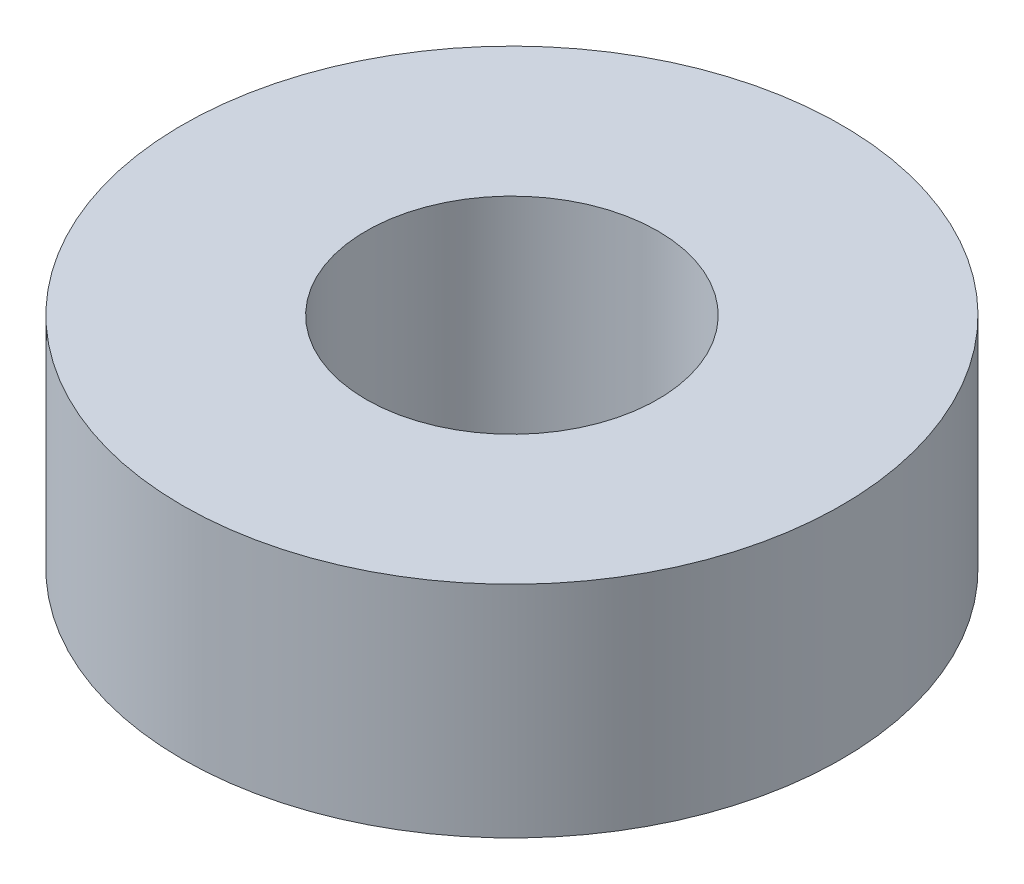
ISO-10303-21;
HEADER;
FILE_DESCRIPTION(('STEP AP214'),'2;1');
FILE_NAME('part.step','',(''),(''),'','','');
FILE_SCHEMA(('AUTOMOTIVE_DESIGN { 1 0 10303 214 1 1 1 1 }'));
ENDSEC;
DATA;
#1=APPLICATION_CONTEXT('core data for automotive mechanical design processes');
#2=APPLICATION_PROTOCOL_DEFINITION('international standard','automotive_design',2000,#1);
#3=PRODUCT_CONTEXT('',#1,'mechanical');
#4=PRODUCT('Part','Part','',(#3));
#5=PRODUCT_RELATED_PRODUCT_CATEGORY('part','',(#4));
#6=PRODUCT_DEFINITION_FORMATION('','',#4);
#7=PRODUCT_DEFINITION_CONTEXT('part definition',#1,'design');
#8=PRODUCT_DEFINITION('design','',#6,#7);
#9=PRODUCT_DEFINITION_SHAPE('','',#8);
#10=(LENGTH_UNIT() NAMED_UNIT(*) SI_UNIT(.MILLI.,.METRE.));
#11=(NAMED_UNIT(*) PLANE_ANGLE_UNIT() SI_UNIT($,.RADIAN.));
#12=(NAMED_UNIT(*) SI_UNIT($,.STERADIAN.) SOLID_ANGLE_UNIT());
#13=UNCERTAINTY_MEASURE_WITH_UNIT(LENGTH_MEASURE(1.E-05),#10,'distance_accuracy_value','');
#14=(GEOMETRIC_REPRESENTATION_CONTEXT(3) GLOBAL_UNCERTAINTY_ASSIGNED_CONTEXT((#13)) GLOBAL_UNIT_ASSIGNED_CONTEXT((#10,
#11,#12)) REPRESENTATION_CONTEXT('',''));
#15=CARTESIAN_POINT('',(0.,0.,0.));
#16=DIRECTION('',(0.,0.,1.));
#17=DIRECTION('',(1.,0.,0.));
#18=AXIS2_PLACEMENT_3D('',#15,#16,#17);
#19=CARTESIAN_POINT('',(0.,3.175,0.));
#20=DIRECTION('',(0.,1.,0.));
#21=DIRECTION('',(0.,0.,1.));
#22=AXIS2_PLACEMENT_3D('',#19,#20,#21);
#23=PLANE('',#22);
#24=CARTESIAN_POINT('',(0.,3.175,0.));
#25=DIRECTION('',(0.,1.,0.));
#26=DIRECTION('',(0.,0.,1.));
#27=AXIS2_PLACEMENT_3D('',#24,#25,#26);
#28=CIRCLE('',#27,4.7625);
#29=CARTESIAN_POINT('',(0.,3.175,4.7625));
#30=VERTEX_POINT('',#29);
#31=EDGE_CURVE('E10',#30,#30,#28,.T.);
#32=ORIENTED_EDGE('',*,*,#31,.T.);
#33=EDGE_LOOP('',(#32));
#34=FACE_BOUND('',#33,.T.);
#35=CARTESIAN_POINT('',(0.,3.175,0.));
#36=DIRECTION('',(0.,1.,0.));
#37=DIRECTION('',(0.,0.,1.));
#38=AXIS2_PLACEMENT_3D('',#35,#36,#37);
#39=CIRCLE('',#38,2.1082);
#40=CARTESIAN_POINT('',(0.,3.175,2.1082));
#41=VERTEX_POINT('',#40);
#42=EDGE_CURVE('E50',#41,#41,#39,.T.);
#43=ORIENTED_EDGE('',*,*,#42,.F.);
#44=EDGE_LOOP('',(#43));
#45=FACE_BOUND('',#44,.T.);
#46=ADVANCED_FACE('F37',(#34,#45),#23,.T.);
#47=CARTESIAN_POINT('',(0.,0.,0.));
#48=DIRECTION('',(0.,1.,0.));
#49=DIRECTION('',(0.,0.,1.));
#50=AXIS2_PLACEMENT_3D('',#47,#48,#49);
#51=PLANE('',#50);
#52=CARTESIAN_POINT('',(0.,0.,0.));
#53=DIRECTION('',(0.,1.,0.));
#54=DIRECTION('',(0.,0.,1.));
#55=AXIS2_PLACEMENT_3D('',#52,#53,#54);
#56=CIRCLE('',#55,4.7625);
#57=CARTESIAN_POINT('',(0.,0.,4.7625));
#58=VERTEX_POINT('',#57);
#59=EDGE_CURVE('E41',#58,#58,#56,.T.);
#60=ORIENTED_EDGE('',*,*,#59,.F.);
#61=EDGE_LOOP('',(#60));
#62=FACE_BOUND('',#61,.T.);
#63=CARTESIAN_POINT('',(0.,0.,0.));
#64=DIRECTION('',(0.,1.,0.));
#65=DIRECTION('',(0.,0.,1.));
#66=AXIS2_PLACEMENT_3D('',#63,#64,#65);
#67=CIRCLE('',#66,2.1082);
#68=CARTESIAN_POINT('',(0.,0.,2.1082));
#69=VERTEX_POINT('',#68);
#70=EDGE_CURVE('E52',#69,#69,#67,.T.);
#71=ORIENTED_EDGE('',*,*,#70,.T.);
#72=EDGE_LOOP('',(#71));
#73=FACE_BOUND('',#72,.T.);
#74=ADVANCED_FACE('F64',(#62,#73),#51,.F.);
#75=CARTESIAN_POINT('',(0.,3.175,0.));
#76=DIRECTION('',(0.,-1.,0.));
#77=DIRECTION('',(0.,0.,-1.));
#78=AXIS2_PLACEMENT_3D('',#75,#76,#77);
#79=CYLINDRICAL_SURFACE('',#78,4.7625);
#80=ORIENTED_EDGE('',*,*,#31,.F.);
#81=EDGE_LOOP('',(#80));
#82=FACE_BOUND('',#81,.T.);
#83=ORIENTED_EDGE('',*,*,#59,.T.);
#84=EDGE_LOOP('',(#83));
#85=FACE_BOUND('',#84,.T.);
#86=ADVANCED_FACE('F39',(#82,#85),#79,.T.);
#87=CARTESIAN_POINT('',(0.,3.175,0.));
#88=DIRECTION('',(0.,-1.,0.));
#89=DIRECTION('',(0.,0.,-1.));
#90=AXIS2_PLACEMENT_3D('',#87,#88,#89);
#91=CYLINDRICAL_SURFACE('',#90,2.1082);
#92=ORIENTED_EDGE('',*,*,#42,.T.);
#93=EDGE_LOOP('',(#92));
#94=FACE_BOUND('',#93,.T.);
#95=ORIENTED_EDGE('',*,*,#70,.F.);
#96=EDGE_LOOP('',(#95));
#97=FACE_BOUND('',#96,.T.);
#98=ADVANCED_FACE('F60',(#94,#97),#91,.F.);
#99=CLOSED_SHELL('',(#46,#74,#86,#98));
#100=MANIFOLD_SOLID_BREP('B2',#99);
#101=ADVANCED_BREP_SHAPE_REPRESENTATION('',(#18,#100),#14);
#102=SHAPE_DEFINITION_REPRESENTATION(#9,#101);
ENDSEC;
END-ISO-10303-21;
